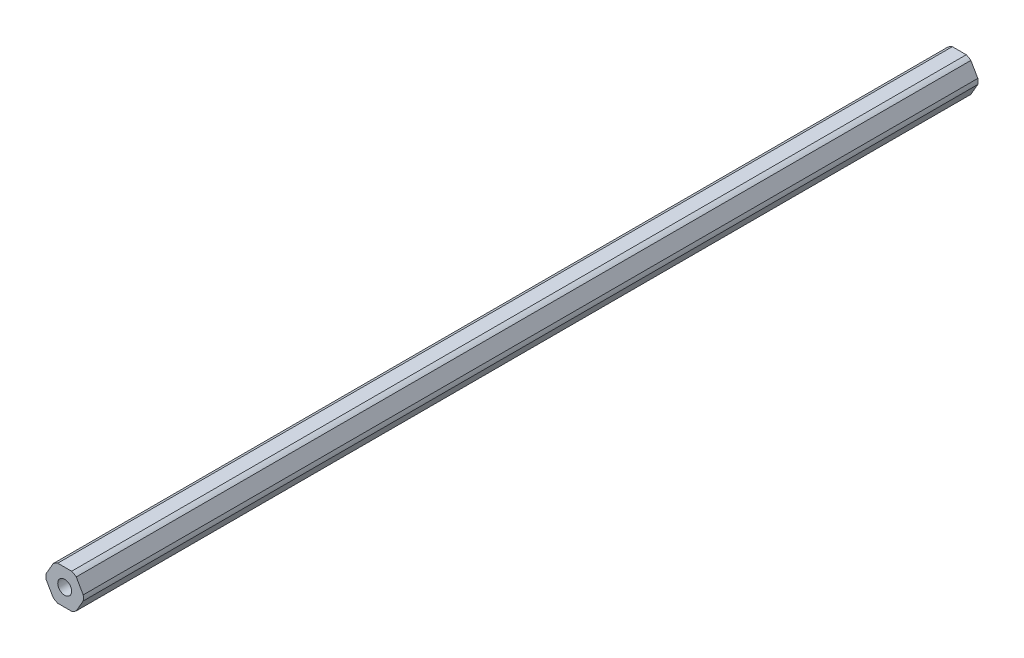
ISO-10303-21;
HEADER;
FILE_DESCRIPTION(('STEP AP214'),'2;1');
FILE_NAME('part.step','',(''),(''),'','','');
FILE_SCHEMA(('AUTOMOTIVE_DESIGN { 1 0 10303 214 1 1 1 1 }'));
ENDSEC;
DATA;
#1=APPLICATION_CONTEXT('core data for automotive mechanical design processes');
#2=APPLICATION_PROTOCOL_DEFINITION('international standard','automotive_design',2000,#1);
#3=PRODUCT_CONTEXT('',#1,'mechanical');
#4=PRODUCT('Part','Part','',(#3));
#5=PRODUCT_RELATED_PRODUCT_CATEGORY('part','',(#4));
#6=PRODUCT_DEFINITION_FORMATION('','',#4);
#7=PRODUCT_DEFINITION_CONTEXT('part definition',#1,'design');
#8=PRODUCT_DEFINITION('design','',#6,#7);
#9=PRODUCT_DEFINITION_SHAPE('','',#8);
#10=(LENGTH_UNIT() NAMED_UNIT(*) SI_UNIT(.MILLI.,.METRE.));
#11=(NAMED_UNIT(*) PLANE_ANGLE_UNIT() SI_UNIT($,.RADIAN.));
#12=(NAMED_UNIT(*) SI_UNIT($,.STERADIAN.) SOLID_ANGLE_UNIT());
#13=UNCERTAINTY_MEASURE_WITH_UNIT(LENGTH_MEASURE(1.E-05),#10,'distance_accuracy_value','');
#14=(GEOMETRIC_REPRESENTATION_CONTEXT(3) GLOBAL_UNCERTAINTY_ASSIGNED_CONTEXT((#13)) GLOBAL_UNIT_ASSIGNED_CONTEXT((#10,
#11,#12)) REPRESENTATION_CONTEXT('',''));
#15=CARTESIAN_POINT('',(0.,0.,0.));
#16=DIRECTION('',(0.,0.,1.));
#17=DIRECTION('',(1.,0.,0.));
#18=AXIS2_PLACEMENT_3D('',#15,#16,#17);
#19=CARTESIAN_POINT('',(0.,0.,-228.6));
#20=DIRECTION('',(0.,0.,1.));
#21=DIRECTION('',(1.,0.,0.));
#22=AXIS2_PLACEMENT_3D('',#19,#20,#21);
#23=CYLINDRICAL_SURFACE('',#22,6.87);
#24=CARTESIAN_POINT('',(0.,0.,99.8592004885599));
#25=DIRECTION('',(0.,0.,-1.));
#26=DIRECTION('',(-1.,0.,0.));
#27=AXIS2_PLACEMENT_3D('',#24,#25,#26);
#28=CIRCLE('',#27,6.87);
#29=CARTESIAN_POINT('',(6.80102150534208,-0.971085209378955,99.8592004885599));
#30=VERTEX_POINT('',#29);
#31=CARTESIAN_POINT('',(6.80102150534208,0.97108520937895,99.8592004885599));
#32=VERTEX_POINT('',#31);
#33=EDGE_CURVE('E143',#30,#32,#28,.F.);
#34=ORIENTED_EDGE('',*,*,#33,.F.);
#35=DIRECTION('',(0.,0.,1.));
#36=VECTOR('',#35,1.);
#37=CARTESIAN_POINT('',(6.80102150534208,-0.971085209378955,228.6));
#38=LINE('',#37,#36);
#39=CARTESIAN_POINT('',(6.80102150534208,-0.971085209378953,-228.6));
#40=VERTEX_POINT('',#39);
#41=EDGE_CURVE('E200',#30,#40,#38,.F.);
#42=ORIENTED_EDGE('',*,*,#41,.T.);
#43=CARTESIAN_POINT('',(0.,0.,-228.6));
#44=DIRECTION('',(0.,0.,1.));
#45=DIRECTION('',(1.,0.,0.));
#46=AXIS2_PLACEMENT_3D('',#43,#44,#45);
#47=CIRCLE('',#46,6.87);
#48=CARTESIAN_POINT('',(6.80102150534208,0.971085209378948,-228.6));
#49=VERTEX_POINT('',#48);
#50=EDGE_CURVE('E172',#40,#49,#47,.T.);
#51=ORIENTED_EDGE('',*,*,#50,.T.);
#52=DIRECTION('',(0.,0.,1.));
#53=VECTOR('',#52,1.);
#54=CARTESIAN_POINT('',(6.80102150534208,0.97108520937895,228.6));
#55=LINE('',#54,#53);
#56=EDGE_CURVE('E193',#49,#32,#55,.T.);
#57=ORIENTED_EDGE('',*,*,#56,.T.);
#58=EDGE_LOOP('',(#34,#42,#51,#57));
#59=FACE_BOUND('',#58,.T.);
#60=ADVANCED_FACE('F35',(#59),#23,.T.);
#61=CARTESIAN_POINT('',(3.68083890619154,6.3754,228.6));
#62=DIRECTION('',(0.,-1.,0.));
#63=DIRECTION('',(1.,0.,0.));
#64=AXIS2_PLACEMENT_3D('',#61,#62,#63);
#65=PLANE('',#64);
#66=DIRECTION('',(0.,0.,1.));
#67=VECTOR('',#66,1.);
#68=CARTESIAN_POINT('',(-2.55952629210953,6.37540000000001,-228.6));
#69=LINE('',#68,#67);
#70=CARTESIAN_POINT('',(-2.55952629210953,6.37540000000001,99.8592004885599));
#71=VERTEX_POINT('',#70);
#72=CARTESIAN_POINT('',(-2.55952629210953,6.37540000000001,-228.6));
#73=VERTEX_POINT('',#72);
#74=EDGE_CURVE('E141',#71,#73,#69,.F.);
#75=ORIENTED_EDGE('',*,*,#74,.F.);
#76=DIRECTION('',(1.,0.,0.));
#77=VECTOR('',#76,1.);
#78=CARTESIAN_POINT('',(3.68083890619182,6.3754,99.8592004885599));
#79=LINE('',#78,#77);
#80=CARTESIAN_POINT('',(2.55952629210953,6.37540000000001,99.8592004885599));
#81=VERTEX_POINT('',#80);
#82=EDGE_CURVE('E139',#71,#81,#79,.T.);
#83=ORIENTED_EDGE('',*,*,#82,.T.);
#84=DIRECTION('',(0.,0.,1.));
#85=VECTOR('',#84,1.);
#86=CARTESIAN_POINT('',(2.55952629210953,6.37540000000001,-228.6));
#87=LINE('',#86,#85);
#88=CARTESIAN_POINT('',(2.55952629210953,6.37540000000001,-228.6));
#89=VERTEX_POINT('',#88);
#90=EDGE_CURVE('E126',#89,#81,#87,.T.);
#91=ORIENTED_EDGE('',*,*,#90,.F.);
#92=DIRECTION('',(1.,0.,0.));
#93=VECTOR('',#92,1.);
#94=CARTESIAN_POINT('',(0.,6.3754,-228.6));
#95=LINE('',#94,#93);
#96=EDGE_CURVE('E135',#89,#73,#95,.F.);
#97=ORIENTED_EDGE('',*,*,#96,.T.);
#98=EDGE_LOOP('',(#75,#83,#91,#97));
#99=FACE_BOUND('',#98,.T.);
#100=ADVANCED_FACE('F140',(#99),#65,.F.);
#101=CARTESIAN_POINT('',(0.,0.,-228.6));
#102=DIRECTION('',(0.,0.,1.));
#103=DIRECTION('',(1.,0.,0.));
#104=AXIS2_PLACEMENT_3D('',#101,#102,#103);
#105=CYLINDRICAL_SURFACE('',#104,6.87);
#106=CARTESIAN_POINT('',(0.,0.,99.8592004885599));
#107=DIRECTION('',(0.,0.,-1.));
#108=DIRECTION('',(-1.,0.,0.));
#109=AXIS2_PLACEMENT_3D('',#106,#107,#108);
#110=CIRCLE('',#109,6.87);
#111=CARTESIAN_POINT('',(-4.24149521323255,5.40431479062104,99.8592004885599));
#112=VERTEX_POINT('',#111);
#113=EDGE_CURVE('E51',#71,#112,#110,.F.);
#114=ORIENTED_EDGE('',*,*,#113,.F.);
#115=ORIENTED_EDGE('',*,*,#74,.T.);
#116=CARTESIAN_POINT('',(0.,0.,-228.6));
#117=DIRECTION('',(0.,0.,1.));
#118=DIRECTION('',(1.,0.,0.));
#119=AXIS2_PLACEMENT_3D('',#116,#117,#118);
#120=CIRCLE('',#119,6.87);
#121=CARTESIAN_POINT('',(-4.24149521323255,5.40431479062105,-228.6));
#122=VERTEX_POINT('',#121);
#123=EDGE_CURVE('E191',#73,#122,#120,.T.);
#124=ORIENTED_EDGE('',*,*,#123,.T.);
#125=DIRECTION('',(0.,0.,1.));
#126=VECTOR('',#125,1.);
#127=CARTESIAN_POINT('',(-4.24149521323255,5.40431479062104,228.6));
#128=LINE('',#127,#126);
#129=EDGE_CURVE('E214',#122,#112,#128,.T.);
#130=ORIENTED_EDGE('',*,*,#129,.T.);
#131=EDGE_LOOP('',(#114,#115,#124,#130));
#132=FACE_BOUND('',#131,.T.);
#133=ADVANCED_FACE('F239',(#132),#105,.T.);
#134=CARTESIAN_POINT('',(-3.68083890619154,6.3754,228.6));
#135=DIRECTION('',(0.866025403784439,-0.5,0.));
#136=DIRECTION('',(0.5,0.866025403784439,0.));
#137=AXIS2_PLACEMENT_3D('',#134,#135,#136);
#138=PLANE('',#137);
#139=DIRECTION('',(0.,0.,1.));
#140=VECTOR('',#139,1.);
#141=CARTESIAN_POINT('',(-6.80102150534208,0.971085209378959,-228.6));
#142=LINE('',#141,#140);
#143=CARTESIAN_POINT('',(-6.80102150534208,0.971085209378959,99.8592004885599));
#144=VERTEX_POINT('',#143);
#145=CARTESIAN_POINT('',(-6.80102150534208,0.971085209378961,-228.6));
#146=VERTEX_POINT('',#145);
#147=EDGE_CURVE('E212',#144,#146,#142,.F.);
#148=ORIENTED_EDGE('',*,*,#147,.F.);
#149=DIRECTION('',(0.5,0.866025403784439,0.));
#150=VECTOR('',#149,1.);
#151=CARTESIAN_POINT('',(-3.68083890619141,6.37540000000024,99.8592004885599));
#152=LINE('',#151,#150);
#153=EDGE_CURVE('E59',#144,#112,#152,.T.);
#154=ORIENTED_EDGE('',*,*,#153,.T.);
#155=ORIENTED_EDGE('',*,*,#129,.F.);
#156=DIRECTION('',(-0.5,-0.866025403784439,0.));
#157=VECTOR('',#156,1.);
#158=CARTESIAN_POINT('',(-4.24149521323255,5.40431479062104,-228.6));
#159=LINE('',#158,#157);
#160=EDGE_CURVE('E188',#122,#146,#159,.T.);
#161=ORIENTED_EDGE('',*,*,#160,.T.);
#162=EDGE_LOOP('',(#148,#154,#155,#161));
#163=FACE_BOUND('',#162,.T.);
#164=ADVANCED_FACE('F243',(#163),#138,.F.);
#165=CARTESIAN_POINT('',(0.,0.,-228.6));
#166=DIRECTION('',(0.,0.,1.));
#167=DIRECTION('',(1.,0.,0.));
#168=AXIS2_PLACEMENT_3D('',#165,#166,#167);
#169=CYLINDRICAL_SURFACE('',#168,6.87);
#170=CARTESIAN_POINT('',(0.,0.,99.8592004885599));
#171=DIRECTION('',(0.,0.,-1.));
#172=DIRECTION('',(-1.,0.,0.));
#173=AXIS2_PLACEMENT_3D('',#170,#171,#172);
#174=CIRCLE('',#173,6.87);
#175=CARTESIAN_POINT('',(-6.80102150534208,-0.971085209378956,99.8592004885599));
#176=VERTEX_POINT('',#175);
#177=EDGE_CURVE('E167',#144,#176,#174,.F.);
#178=ORIENTED_EDGE('',*,*,#177,.F.);
#179=ORIENTED_EDGE('',*,*,#147,.T.);
#180=CARTESIAN_POINT('',(0.,0.,-228.6));
#181=DIRECTION('',(0.,0.,1.));
#182=DIRECTION('',(1.,0.,0.));
#183=AXIS2_PLACEMENT_3D('',#180,#181,#182);
#184=CIRCLE('',#183,6.87);
#185=CARTESIAN_POINT('',(-6.80102150534208,-0.971085209378956,-228.6));
#186=VERTEX_POINT('',#185);
#187=EDGE_CURVE('E187',#146,#186,#184,.T.);
#188=ORIENTED_EDGE('',*,*,#187,.T.);
#189=DIRECTION('',(0.,0.,1.));
#190=VECTOR('',#189,1.);
#191=CARTESIAN_POINT('',(-6.80102150534208,-0.971085209378956,228.6));
#192=LINE('',#191,#190);
#193=EDGE_CURVE('E209',#186,#176,#192,.T.);
#194=ORIENTED_EDGE('',*,*,#193,.T.);
#195=EDGE_LOOP('',(#178,#179,#188,#194));
#196=FACE_BOUND('',#195,.T.);
#197=ADVANCED_FACE('F242',(#196),#169,.T.);
#198=CARTESIAN_POINT('',(-7.36167781238308,0.,228.6));
#199=DIRECTION('',(0.866025403784439,0.5,0.));
#200=DIRECTION('',(-0.5,0.866025403784439,0.));
#201=AXIS2_PLACEMENT_3D('',#198,#199,#200);
#202=PLANE('',#201);
#203=DIRECTION('',(0.,0.,1.));
#204=VECTOR('',#203,1.);
#205=CARTESIAN_POINT('',(-4.24149521323255,-5.40431479062105,-228.6));
#206=LINE('',#205,#204);
#207=CARTESIAN_POINT('',(-4.24149521323255,-5.40431479062105,99.8592004885599));
#208=VERTEX_POINT('',#207);
#209=CARTESIAN_POINT('',(-4.24149521323254,-5.40431479062105,-228.6));
#210=VERTEX_POINT('',#209);
#211=EDGE_CURVE('E207',#208,#210,#206,.F.);
#212=ORIENTED_EDGE('',*,*,#211,.F.);
#213=DIRECTION('',(-0.5,0.866025403784439,0.));
#214=VECTOR('',#213,1.);
#215=CARTESIAN_POINT('',(-7.36167781238308,0.,99.8592004885599));
#216=LINE('',#215,#214);
#217=EDGE_CURVE('E165',#208,#176,#216,.T.);
#218=ORIENTED_EDGE('',*,*,#217,.T.);
#219=ORIENTED_EDGE('',*,*,#193,.F.);
#220=DIRECTION('',(0.5,-0.866025403784438,0.));
#221=VECTOR('',#220,1.);
#222=CARTESIAN_POINT('',(-6.80102150534208,-0.971085209378956,-228.6));
#223=LINE('',#222,#221);
#224=EDGE_CURVE('E184',#186,#210,#223,.T.);
#225=ORIENTED_EDGE('',*,*,#224,.T.);
#226=EDGE_LOOP('',(#212,#218,#219,#225));
#227=FACE_BOUND('',#226,.T.);
#228=ADVANCED_FACE('F250',(#227),#202,.F.);
#229=CARTESIAN_POINT('',(0.,0.,-228.6));
#230=DIRECTION('',(0.,0.,1.));
#231=DIRECTION('',(1.,0.,0.));
#232=AXIS2_PLACEMENT_3D('',#229,#230,#231);
#233=CYLINDRICAL_SURFACE('',#232,6.87);
#234=CARTESIAN_POINT('',(0.,0.,99.8592004885599));
#235=DIRECTION('',(0.,0.,-1.));
#236=DIRECTION('',(-1.,0.,0.));
#237=AXIS2_PLACEMENT_3D('',#234,#235,#236);
#238=CIRCLE('',#237,6.87);
#239=CARTESIAN_POINT('',(-2.55952629210953,-6.3754,99.8592004885599));
#240=VERTEX_POINT('',#239);
#241=EDGE_CURVE('E162',#208,#240,#238,.F.);
#242=ORIENTED_EDGE('',*,*,#241,.F.);
#243=ORIENTED_EDGE('',*,*,#211,.T.);
#244=CARTESIAN_POINT('',(0.,0.,-228.6));
#245=DIRECTION('',(0.,0.,1.));
#246=DIRECTION('',(1.,0.,0.));
#247=AXIS2_PLACEMENT_3D('',#244,#245,#246);
#248=CIRCLE('',#247,6.87);
#249=CARTESIAN_POINT('',(-2.55952629210953,-6.3754,-228.6));
#250=VERTEX_POINT('',#249);
#251=EDGE_CURVE('E183',#210,#250,#248,.T.);
#252=ORIENTED_EDGE('',*,*,#251,.T.);
#253=DIRECTION('',(0.,0.,1.));
#254=VECTOR('',#253,1.);
#255=CARTESIAN_POINT('',(-2.55952629210953,-6.3754,228.6));
#256=LINE('',#255,#254);
#257=EDGE_CURVE('E204',#250,#240,#256,.T.);
#258=ORIENTED_EDGE('',*,*,#257,.T.);
#259=EDGE_LOOP('',(#242,#243,#252,#258));
#260=FACE_BOUND('',#259,.T.);
#261=ADVANCED_FACE('F281',(#260),#233,.T.);
#262=CARTESIAN_POINT('',(-3.68083890619154,-6.3754,228.6));
#263=DIRECTION('',(0.,1.,0.));
#264=DIRECTION('',(0.,0.,1.));
#265=AXIS2_PLACEMENT_3D('',#262,#263,#264);
#266=PLANE('',#265);
#267=DIRECTION('',(0.,0.,1.));
#268=VECTOR('',#267,1.);
#269=CARTESIAN_POINT('',(2.55952629210953,-6.3754,-228.6));
#270=LINE('',#269,#268);
#271=CARTESIAN_POINT('',(2.55952629210953,-6.3754,99.8592004885599));
#272=VERTEX_POINT('',#271);
#273=CARTESIAN_POINT('',(2.55952629210953,-6.3754,-228.6));
#274=VERTEX_POINT('',#273);
#275=EDGE_CURVE('E202',#272,#274,#270,.F.);
#276=ORIENTED_EDGE('',*,*,#275,.F.);
#277=DIRECTION('',(-1.,0.,0.));
#278=VECTOR('',#277,1.);
#279=CARTESIAN_POINT('',(-3.68083890619126,-6.3754,99.8592004885599));
#280=LINE('',#279,#278);
#281=EDGE_CURVE('E160',#272,#240,#280,.T.);
#282=ORIENTED_EDGE('',*,*,#281,.T.);
#283=ORIENTED_EDGE('',*,*,#257,.F.);
#284=DIRECTION('',(1.,0.,0.));
#285=VECTOR('',#284,1.);
#286=CARTESIAN_POINT('',(0.,-6.3754,-228.6));
#287=LINE('',#286,#285);
#288=EDGE_CURVE('E180',#250,#274,#287,.T.);
#289=ORIENTED_EDGE('',*,*,#288,.T.);
#290=EDGE_LOOP('',(#276,#282,#283,#289));
#291=FACE_BOUND('',#290,.T.);
#292=ADVANCED_FACE('F277',(#291),#266,.F.);
#293=CARTESIAN_POINT('',(0.,0.,-228.6));
#294=DIRECTION('',(0.,0.,1.));
#295=DIRECTION('',(1.,0.,0.));
#296=AXIS2_PLACEMENT_3D('',#293,#294,#295);
#297=CYLINDRICAL_SURFACE('',#296,6.87);
#298=CARTESIAN_POINT('',(0.,0.,99.8592004885599));
#299=DIRECTION('',(0.,0.,-1.));
#300=DIRECTION('',(-1.,0.,0.));
#301=AXIS2_PLACEMENT_3D('',#298,#299,#300);
#302=CIRCLE('',#301,6.87);
#303=CARTESIAN_POINT('',(4.24149521323254,-5.40431479062105,99.8592004885599));
#304=VERTEX_POINT('',#303);
#305=EDGE_CURVE('E157',#272,#304,#302,.F.);
#306=ORIENTED_EDGE('',*,*,#305,.F.);
#307=ORIENTED_EDGE('',*,*,#275,.T.);
#308=CARTESIAN_POINT('',(0.,0.,-228.6));
#309=DIRECTION('',(0.,0.,1.));
#310=DIRECTION('',(1.,0.,0.));
#311=AXIS2_PLACEMENT_3D('',#308,#309,#310);
#312=CIRCLE('',#311,6.87);
#313=CARTESIAN_POINT('',(4.24149521323254,-5.40431479062105,-228.6));
#314=VERTEX_POINT('',#313);
#315=EDGE_CURVE('E179',#274,#314,#312,.T.);
#316=ORIENTED_EDGE('',*,*,#315,.T.);
#317=DIRECTION('',(0.,0.,1.));
#318=VECTOR('',#317,1.);
#319=CARTESIAN_POINT('',(4.24149521323254,-5.40431479062105,228.6));
#320=LINE('',#319,#318);
#321=EDGE_CURVE('E197',#314,#304,#320,.T.);
#322=ORIENTED_EDGE('',*,*,#321,.T.);
#323=EDGE_LOOP('',(#306,#307,#316,#322));
#324=FACE_BOUND('',#323,.T.);
#325=ADVANCED_FACE('F273',(#324),#297,.T.);
#326=CARTESIAN_POINT('',(3.68083890619154,-6.3754,228.6));
#327=DIRECTION('',(-0.866025403784439,0.5,0.));
#328=DIRECTION('',(-0.5,-0.866025403784439,0.));
#329=AXIS2_PLACEMENT_3D('',#326,#327,#328);
#330=PLANE('',#329);
#331=ORIENTED_EDGE('',*,*,#41,.F.);
#332=DIRECTION('',(-0.5,-0.866025403784439,0.));
#333=VECTOR('',#332,1.);
#334=CARTESIAN_POINT('',(3.68083890619168,-6.37539999999977,99.8592004885599));
#335=LINE('',#334,#333);
#336=EDGE_CURVE('E155',#30,#304,#335,.T.);
#337=ORIENTED_EDGE('',*,*,#336,.T.);
#338=ORIENTED_EDGE('',*,*,#321,.F.);
#339=DIRECTION('',(0.5,0.866025403784439,0.));
#340=VECTOR('',#339,1.);
#341=CARTESIAN_POINT('',(4.24149521323254,-5.40431479062105,-228.6));
#342=LINE('',#341,#340);
#343=EDGE_CURVE('E176',#314,#40,#342,.T.);
#344=ORIENTED_EDGE('',*,*,#343,.T.);
#345=EDGE_LOOP('',(#331,#337,#338,#344));
#346=FACE_BOUND('',#345,.T.);
#347=ADVANCED_FACE('F270',(#346),#330,.F.);
#348=CARTESIAN_POINT('',(7.36167781238308,0.,228.6));
#349=DIRECTION('',(-0.866025403784439,-0.5,0.));
#350=DIRECTION('',(0.5,-0.866025403784439,0.));
#351=AXIS2_PLACEMENT_3D('',#348,#349,#350);
#352=PLANE('',#351);
#353=DIRECTION('',(0.,0.,1.));
#354=VECTOR('',#353,1.);
#355=CARTESIAN_POINT('',(4.24149521323254,5.40431479062105,-228.6));
#356=LINE('',#355,#354);
#357=CARTESIAN_POINT('',(4.24149521323254,5.40431479062105,99.8592004885599));
#358=VERTEX_POINT('',#357);
#359=CARTESIAN_POINT('',(4.24149521323254,5.40431479062105,-228.6));
#360=VERTEX_POINT('',#359);
#361=EDGE_CURVE('E136',#358,#360,#356,.F.);
#362=ORIENTED_EDGE('',*,*,#361,.F.);
#363=DIRECTION('',(0.5,-0.866025403784439,0.));
#364=VECTOR('',#363,1.);
#365=CARTESIAN_POINT('',(7.36167781238309,0.,99.8592004885599));
#366=LINE('',#365,#364);
#367=EDGE_CURVE('E144',#358,#32,#366,.T.);
#368=ORIENTED_EDGE('',*,*,#367,.T.);
#369=ORIENTED_EDGE('',*,*,#56,.F.);
#370=DIRECTION('',(-0.5,0.866025403784438,0.));
#371=VECTOR('',#370,1.);
#372=CARTESIAN_POINT('',(6.80102150534208,0.97108520937895,-228.6));
#373=LINE('',#372,#371);
#374=EDGE_CURVE('E173',#49,#360,#373,.T.);
#375=ORIENTED_EDGE('',*,*,#374,.T.);
#376=EDGE_LOOP('',(#362,#368,#369,#375));
#377=FACE_BOUND('',#376,.T.);
#378=ADVANCED_FACE('F233',(#377),#352,.F.);
#379=CARTESIAN_POINT('',(0.,0.,-228.6));
#380=DIRECTION('',(0.,0.,1.));
#381=DIRECTION('',(1.,0.,0.));
#382=AXIS2_PLACEMENT_3D('',#379,#380,#381);
#383=CYLINDRICAL_SURFACE('',#382,6.87);
#384=CARTESIAN_POINT('',(0.,0.,99.8592004885599));
#385=DIRECTION('',(0.,0.,-1.));
#386=DIRECTION('',(-1.,0.,0.));
#387=AXIS2_PLACEMENT_3D('',#384,#385,#386);
#388=CIRCLE('',#387,6.87);
#389=EDGE_CURVE('E130',#358,#81,#388,.F.);
#390=ORIENTED_EDGE('',*,*,#389,.F.);
#391=ORIENTED_EDGE('',*,*,#361,.T.);
#392=CARTESIAN_POINT('',(0.,0.,-228.6));
#393=DIRECTION('',(0.,0.,1.));
#394=DIRECTION('',(1.,0.,0.));
#395=AXIS2_PLACEMENT_3D('',#392,#393,#394);
#396=CIRCLE('',#395,6.87);
#397=EDGE_CURVE('E43',#360,#89,#396,.T.);
#398=ORIENTED_EDGE('',*,*,#397,.T.);
#399=ORIENTED_EDGE('',*,*,#90,.T.);
#400=EDGE_LOOP('',(#390,#391,#398,#399));
#401=FACE_BOUND('',#400,.T.);
#402=ADVANCED_FACE('F128',(#401),#383,.T.);
#403=CARTESIAN_POINT('',(0.,0.,-228.6));
#404=DIRECTION('',(0.,0.,1.));
#405=DIRECTION('',(1.,0.,0.));
#406=AXIS2_PLACEMENT_3D('',#403,#404,#405);
#407=PLANE('',#406);
#408=ORIENTED_EDGE('',*,*,#374,.F.);
#409=ORIENTED_EDGE('',*,*,#50,.F.);
#410=ORIENTED_EDGE('',*,*,#343,.F.);
#411=ORIENTED_EDGE('',*,*,#315,.F.);
#412=ORIENTED_EDGE('',*,*,#288,.F.);
#413=ORIENTED_EDGE('',*,*,#251,.F.);
#414=ORIENTED_EDGE('',*,*,#224,.F.);
#415=ORIENTED_EDGE('',*,*,#187,.F.);
#416=ORIENTED_EDGE('',*,*,#160,.F.);
#417=ORIENTED_EDGE('',*,*,#123,.F.);
#418=ORIENTED_EDGE('',*,*,#96,.F.);
#419=ORIENTED_EDGE('',*,*,#397,.F.);
#420=EDGE_LOOP('',(#408,#409,#410,#411,#412,#413,#414,#415,#416,#417,#418,#419));
#421=FACE_BOUND('',#420,.T.);
#422=CARTESIAN_POINT('',(0.,0.,-228.6));
#423=DIRECTION('',(0.,0.,1.));
#424=DIRECTION('',(1.,0.,0.));
#425=AXIS2_PLACEMENT_3D('',#422,#423,#424);
#426=CIRCLE('',#425,2.55);
#427=CARTESIAN_POINT('',(2.55,0.,-228.6));
#428=VERTEX_POINT('',#427);
#429=EDGE_CURVE('E12',#428,#428,#426,.T.);
#430=ORIENTED_EDGE('',*,*,#429,.T.);
#431=EDGE_LOOP('',(#430));
#432=FACE_BOUND('',#431,.T.);
#433=ADVANCED_FACE('F234',(#421,#432),#407,.F.);
#434=CARTESIAN_POINT('',(0.,0.,-228.6));
#435=DIRECTION('',(0.,0.,1.));
#436=DIRECTION('',(1.,0.,0.));
#437=AXIS2_PLACEMENT_3D('',#434,#435,#436);
#438=CYLINDRICAL_SURFACE('',#437,2.55);
#439=CARTESIAN_POINT('',(0.,0.,99.8592004885599));
#440=DIRECTION('',(0.,0.,-1.));
#441=DIRECTION('',(-1.,0.,0.));
#442=AXIS2_PLACEMENT_3D('',#439,#440,#441);
#443=CIRCLE('',#442,2.55);
#444=CARTESIAN_POINT('',(-2.55,0.,99.8592004885599));
#445=VERTEX_POINT('',#444);
#446=EDGE_CURVE('E38',#445,#445,#443,.F.);
#447=ORIENTED_EDGE('',*,*,#446,.T.);
#448=EDGE_LOOP('',(#447));
#449=FACE_BOUND('',#448,.T.);
#450=ORIENTED_EDGE('',*,*,#429,.F.);
#451=EDGE_LOOP('',(#450));
#452=FACE_BOUND('',#451,.T.);
#453=ADVANCED_FACE('F253',(#449,#452),#438,.F.);
#454=CARTESIAN_POINT('',(-2.40633023314109E-13,0.,99.8592004885599));
#455=DIRECTION('',(0.,0.,-1.));
#456=DIRECTION('',(-1.,0.,0.));
#457=AXIS2_PLACEMENT_3D('',#454,#455,#456);
#458=PLANE('',#457);
#459=ORIENTED_EDGE('',*,*,#82,.F.);
#460=ORIENTED_EDGE('',*,*,#113,.T.);
#461=ORIENTED_EDGE('',*,*,#153,.F.);
#462=ORIENTED_EDGE('',*,*,#177,.T.);
#463=ORIENTED_EDGE('',*,*,#217,.F.);
#464=ORIENTED_EDGE('',*,*,#241,.T.);
#465=ORIENTED_EDGE('',*,*,#281,.F.);
#466=ORIENTED_EDGE('',*,*,#305,.T.);
#467=ORIENTED_EDGE('',*,*,#336,.F.);
#468=ORIENTED_EDGE('',*,*,#33,.T.);
#469=ORIENTED_EDGE('',*,*,#367,.F.);
#470=ORIENTED_EDGE('',*,*,#389,.T.);
#471=EDGE_LOOP('',(#459,#460,#461,#462,#463,#464,#465,#466,#467,#468,#469,#470));
#472=FACE_BOUND('',#471,.T.);
#473=ORIENTED_EDGE('',*,*,#446,.F.);
#474=EDGE_LOOP('',(#473));
#475=FACE_BOUND('',#474,.T.);
#476=ADVANCED_FACE('F147',(#472,#475),#458,.F.);
#477=CLOSED_SHELL('',(#60,#100,#133,#164,#197,#228,#261,#292,#325,#347,#378,#402,#433,#453,#476));
#478=MANIFOLD_SOLID_BREP('B2',#477);
#479=ADVANCED_BREP_SHAPE_REPRESENTATION('',(#18,#478),#14);
#480=SHAPE_DEFINITION_REPRESENTATION(#9,#479);
ENDSEC;
END-ISO-10303-21;
